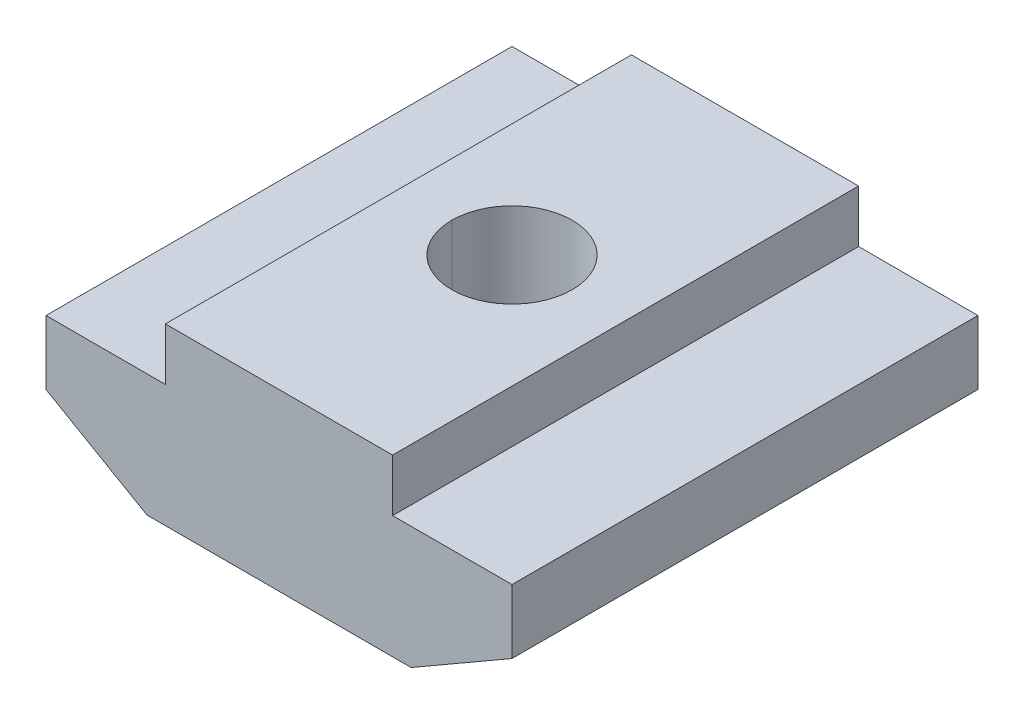
ISO-10303-21;
HEADER;
FILE_DESCRIPTION(('STEP AP214'),'2;1');
FILE_NAME('part.step','',(''),(''),'','','');
FILE_SCHEMA(('AUTOMOTIVE_DESIGN { 1 0 10303 214 1 1 1 1 }'));
ENDSEC;
DATA;
#1=APPLICATION_CONTEXT('core data for automotive mechanical design processes');
#2=APPLICATION_PROTOCOL_DEFINITION('international standard','automotive_design',2000,#1);
#3=PRODUCT_CONTEXT('',#1,'mechanical');
#4=PRODUCT('Part','Part','',(#3));
#5=PRODUCT_RELATED_PRODUCT_CATEGORY('part','',(#4));
#6=PRODUCT_DEFINITION_FORMATION('','',#4);
#7=PRODUCT_DEFINITION_CONTEXT('part definition',#1,'design');
#8=PRODUCT_DEFINITION('design','',#6,#7);
#9=PRODUCT_DEFINITION_SHAPE('','',#8);
#10=(LENGTH_UNIT() NAMED_UNIT(*) SI_UNIT(.MILLI.,.METRE.));
#11=(NAMED_UNIT(*) PLANE_ANGLE_UNIT() SI_UNIT($,.RADIAN.));
#12=(NAMED_UNIT(*) SI_UNIT($,.STERADIAN.) SOLID_ANGLE_UNIT());
#13=UNCERTAINTY_MEASURE_WITH_UNIT(LENGTH_MEASURE(1.E-05),#10,'distance_accuracy_value','');
#14=(GEOMETRIC_REPRESENTATION_CONTEXT(3) GLOBAL_UNCERTAINTY_ASSIGNED_CONTEXT((#13)) GLOBAL_UNIT_ASSIGNED_CONTEXT((#10,
#11,#12)) REPRESENTATION_CONTEXT('',''));
#15=CARTESIAN_POINT('',(0.,0.,0.));
#16=DIRECTION('',(0.,0.,1.));
#17=DIRECTION('',(1.,0.,0.));
#18=AXIS2_PLACEMENT_3D('',#15,#16,#17);
#19=CARTESIAN_POINT('',(-8.,-0.1,0.));
#20=DIRECTION('',(0.50000000000019,0.866025403784329,0.));
#21=DIRECTION('',(0.,0.,-1.));
#22=AXIS2_PLACEMENT_3D('',#19,#20,#21);
#23=PLANE('',#22);
#24=DIRECTION('',(0.,0.,1.));
#25=VECTOR('',#24,1.);
#26=CARTESIAN_POINT('',(-8.,-0.1,0.));
#27=LINE('',#26,#25);
#28=CARTESIAN_POINT('',(-8.,-0.1,-8.));
#29=VERTEX_POINT('',#28);
#30=CARTESIAN_POINT('',(-8.,-0.1,8.));
#31=VERTEX_POINT('',#30);
#32=EDGE_CURVE('E245',#29,#31,#27,.T.);
#33=ORIENTED_EDGE('',*,*,#32,.F.);
#34=DIRECTION('',(0.866025403784329,-0.50000000000019,0.));
#35=VECTOR('',#34,1.);
#36=CARTESIAN_POINT('',(-6.26794919243,-1.1,-8.));
#37=LINE('',#36,#35);
#38=CARTESIAN_POINT('',(-4.53589838486,-2.1,-8.));
#39=VERTEX_POINT('',#38);
#40=EDGE_CURVE('E258',#29,#39,#37,.T.);
#41=ORIENTED_EDGE('',*,*,#40,.T.);
#42=DIRECTION('',(0.,0.,1.));
#43=VECTOR('',#42,1.);
#44=CARTESIAN_POINT('',(-4.53589838486,-2.1,0.));
#45=LINE('',#44,#43);
#46=CARTESIAN_POINT('',(-4.53589838486,-2.1,8.));
#47=VERTEX_POINT('',#46);
#48=EDGE_CURVE('E11',#39,#47,#45,.T.);
#49=ORIENTED_EDGE('',*,*,#48,.T.);
#50=DIRECTION('',(-0.866025403784329,0.50000000000019,0.));
#51=VECTOR('',#50,1.);
#52=CARTESIAN_POINT('',(-6.26794919243,-1.1,8.));
#53=LINE('',#52,#51);
#54=EDGE_CURVE('E26',#47,#31,#53,.T.);
#55=ORIENTED_EDGE('',*,*,#54,.T.);
#56=EDGE_LOOP('',(#33,#41,#49,#55));
#57=FACE_BOUND('',#56,.T.);
#58=ADVANCED_FACE('F17',(#57),#23,.F.);
#59=CARTESIAN_POINT('',(8.,-2.1,0.));
#60=DIRECTION('',(0.,1.,0.));
#61=DIRECTION('',(1.,0.,0.));
#62=AXIS2_PLACEMENT_3D('',#59,#60,#61);
#63=PLANE('',#62);
#64=CARTESIAN_POINT('',(0.,-2.1,0.));
#65=DIRECTION('',(0.,1.,0.));
#66=DIRECTION('',(1.,0.,0.));
#67=AXIS2_PLACEMENT_3D('',#64,#65,#66);
#68=CIRCLE('',#67,2.067);
#69=CARTESIAN_POINT('',(-2.067,-2.1,0.));
#70=VERTEX_POINT('',#69);
#71=CARTESIAN_POINT('',(2.067,-2.1,0.));
#72=VERTEX_POINT('',#71);
#73=EDGE_CURVE('E145',#70,#72,#68,.T.);
#74=ORIENTED_EDGE('',*,*,#73,.T.);
#75=CARTESIAN_POINT('',(0.,-2.1,0.));
#76=DIRECTION('',(0.,1.,0.));
#77=DIRECTION('',(1.,0.,0.));
#78=AXIS2_PLACEMENT_3D('',#75,#76,#77);
#79=CIRCLE('',#78,2.067);
#80=EDGE_CURVE('E144',#72,#70,#79,.T.);
#81=ORIENTED_EDGE('',*,*,#80,.T.);
#82=EDGE_LOOP('',(#74,#81));
#83=FACE_BOUND('',#82,.T.);
#84=ORIENTED_EDGE('',*,*,#48,.F.);
#85=DIRECTION('',(1.,0.,0.));
#86=VECTOR('',#85,1.);
#87=CARTESIAN_POINT('',(0.,-2.1,-8.));
#88=LINE('',#87,#86);
#89=CARTESIAN_POINT('',(4.53589838486,-2.1,-8.));
#90=VERTEX_POINT('',#89);
#91=EDGE_CURVE('E261',#39,#90,#88,.T.);
#92=ORIENTED_EDGE('',*,*,#91,.T.);
#93=DIRECTION('',(0.,0.,1.));
#94=VECTOR('',#93,1.);
#95=CARTESIAN_POINT('',(4.53589838486,-2.1,0.));
#96=LINE('',#95,#94);
#97=CARTESIAN_POINT('',(4.53589838486,-2.1,8.));
#98=VERTEX_POINT('',#97);
#99=EDGE_CURVE('E235',#90,#98,#96,.T.);
#100=ORIENTED_EDGE('',*,*,#99,.T.);
#101=DIRECTION('',(1.,0.,0.));
#102=VECTOR('',#101,1.);
#103=CARTESIAN_POINT('',(0.,-2.1,8.));
#104=LINE('',#103,#102);
#105=EDGE_CURVE('E264',#47,#98,#104,.T.);
#106=ORIENTED_EDGE('',*,*,#105,.F.);
#107=EDGE_LOOP('',(#84,#92,#100,#106));
#108=FACE_BOUND('',#107,.T.);
#109=ADVANCED_FACE('F19',(#83,#108),#63,.F.);
#110=CARTESIAN_POINT('',(0.,0.,8.));
#111=DIRECTION('',(0.,0.,1.));
#112=DIRECTION('',(1.,0.,0.));
#113=AXIS2_PLACEMENT_3D('',#110,#111,#112);
#114=PLANE('',#113);
#115=ORIENTED_EDGE('',*,*,#105,.T.);
#116=DIRECTION('',(-0.866025403784329,-0.50000000000019,0.));
#117=VECTOR('',#116,1.);
#118=CARTESIAN_POINT('',(6.26794919243,-1.1,8.));
#119=LINE('',#118,#117);
#120=CARTESIAN_POINT('',(8.,-0.1,8.));
#121=VERTEX_POINT('',#120);
#122=EDGE_CURVE('E248',#121,#98,#119,.T.);
#123=ORIENTED_EDGE('',*,*,#122,.F.);
#124=DIRECTION('',(0.,1.,0.));
#125=VECTOR('',#124,1.);
#126=CARTESIAN_POINT('',(8.,1.,8.));
#127=LINE('',#126,#125);
#128=CARTESIAN_POINT('',(8.,2.1,8.));
#129=VERTEX_POINT('',#128);
#130=EDGE_CURVE('E232',#121,#129,#127,.T.);
#131=ORIENTED_EDGE('',*,*,#130,.T.);
#132=DIRECTION('',(-1.,0.,0.));
#133=VECTOR('',#132,1.);
#134=CARTESIAN_POINT('',(5.95,2.1,8.));
#135=LINE('',#134,#133);
#136=CARTESIAN_POINT('',(3.9,2.1,8.));
#137=VERTEX_POINT('',#136);
#138=EDGE_CURVE('E188',#129,#137,#135,.T.);
#139=ORIENTED_EDGE('',*,*,#138,.T.);
#140=DIRECTION('',(0.,1.,0.));
#141=VECTOR('',#140,1.);
#142=CARTESIAN_POINT('',(3.9,3.,8.));
#143=LINE('',#142,#141);
#144=CARTESIAN_POINT('',(3.9,3.9,8.));
#145=VERTEX_POINT('',#144);
#146=EDGE_CURVE('E193',#137,#145,#143,.T.);
#147=ORIENTED_EDGE('',*,*,#146,.T.);
#148=DIRECTION('',(-1.,0.,0.));
#149=VECTOR('',#148,1.);
#150=CARTESIAN_POINT('',(0.,3.9,8.));
#151=LINE('',#150,#149);
#152=CARTESIAN_POINT('',(-3.9,3.9,8.));
#153=VERTEX_POINT('',#152);
#154=EDGE_CURVE('E192',#145,#153,#151,.T.);
#155=ORIENTED_EDGE('',*,*,#154,.T.);
#156=DIRECTION('',(0.,-1.,0.));
#157=VECTOR('',#156,1.);
#158=CARTESIAN_POINT('',(-3.9,3.,8.));
#159=LINE('',#158,#157);
#160=CARTESIAN_POINT('',(-3.9,2.1,8.));
#161=VERTEX_POINT('',#160);
#162=EDGE_CURVE('E165',#153,#161,#159,.T.);
#163=ORIENTED_EDGE('',*,*,#162,.T.);
#164=DIRECTION('',(-1.,0.,0.));
#165=VECTOR('',#164,1.);
#166=CARTESIAN_POINT('',(-5.95,2.1,8.));
#167=LINE('',#166,#165);
#168=CARTESIAN_POINT('',(-8.,2.1,8.));
#169=VERTEX_POINT('',#168);
#170=EDGE_CURVE('E172',#161,#169,#167,.T.);
#171=ORIENTED_EDGE('',*,*,#170,.T.);
#172=DIRECTION('',(0.,-1.,0.));
#173=VECTOR('',#172,1.);
#174=CARTESIAN_POINT('',(-8.,1.,8.));
#175=LINE('',#174,#173);
#176=EDGE_CURVE('E240',#169,#31,#175,.T.);
#177=ORIENTED_EDGE('',*,*,#176,.T.);
#178=ORIENTED_EDGE('',*,*,#54,.F.);
#179=EDGE_LOOP('',(#115,#123,#131,#139,#147,#155,#163,#171,#177,#178));
#180=FACE_BOUND('',#179,.T.);
#181=ADVANCED_FACE('F270',(#180),#114,.T.);
#182=CARTESIAN_POINT('',(0.,0.,-8.));
#183=DIRECTION('',(0.,0.,1.));
#184=DIRECTION('',(1.,0.,0.));
#185=AXIS2_PLACEMENT_3D('',#182,#183,#184);
#186=PLANE('',#185);
#187=ORIENTED_EDGE('',*,*,#40,.F.);
#188=DIRECTION('',(0.,-1.,0.));
#189=VECTOR('',#188,1.);
#190=CARTESIAN_POINT('',(-8.,1.,-8.));
#191=LINE('',#190,#189);
#192=CARTESIAN_POINT('',(-8.,2.1,-8.));
#193=VERTEX_POINT('',#192);
#194=EDGE_CURVE('E244',#193,#29,#191,.T.);
#195=ORIENTED_EDGE('',*,*,#194,.F.);
#196=DIRECTION('',(-1.,0.,0.));
#197=VECTOR('',#196,1.);
#198=CARTESIAN_POINT('',(-5.95,2.1,-8.));
#199=LINE('',#198,#197);
#200=CARTESIAN_POINT('',(-3.9,2.1,-8.));
#201=VERTEX_POINT('',#200);
#202=EDGE_CURVE('E173',#201,#193,#199,.T.);
#203=ORIENTED_EDGE('',*,*,#202,.F.);
#204=DIRECTION('',(0.,-1.,0.));
#205=VECTOR('',#204,1.);
#206=CARTESIAN_POINT('',(-3.9,3.,-8.));
#207=LINE('',#206,#205);
#208=CARTESIAN_POINT('',(-3.9,3.9,-8.));
#209=VERTEX_POINT('',#208);
#210=EDGE_CURVE('E163',#209,#201,#207,.T.);
#211=ORIENTED_EDGE('',*,*,#210,.F.);
#212=DIRECTION('',(-1.,0.,0.));
#213=VECTOR('',#212,1.);
#214=CARTESIAN_POINT('',(0.,3.9,-8.));
#215=LINE('',#214,#213);
#216=CARTESIAN_POINT('',(3.9,3.9,-8.));
#217=VERTEX_POINT('',#216);
#218=EDGE_CURVE('E189',#217,#209,#215,.T.);
#219=ORIENTED_EDGE('',*,*,#218,.F.);
#220=DIRECTION('',(0.,1.,0.));
#221=VECTOR('',#220,1.);
#222=CARTESIAN_POINT('',(3.9,3.,-8.));
#223=LINE('',#222,#221);
#224=CARTESIAN_POINT('',(3.9,2.1,-8.));
#225=VERTEX_POINT('',#224);
#226=EDGE_CURVE('E212',#225,#217,#223,.T.);
#227=ORIENTED_EDGE('',*,*,#226,.F.);
#228=DIRECTION('',(-1.,0.,0.));
#229=VECTOR('',#228,1.);
#230=CARTESIAN_POINT('',(5.95,2.1,-8.));
#231=LINE('',#230,#229);
#232=CARTESIAN_POINT('',(8.,2.1,-8.));
#233=VERTEX_POINT('',#232);
#234=EDGE_CURVE('E162',#233,#225,#231,.T.);
#235=ORIENTED_EDGE('',*,*,#234,.F.);
#236=DIRECTION('',(0.,1.,0.));
#237=VECTOR('',#236,1.);
#238=CARTESIAN_POINT('',(8.,1.,-8.));
#239=LINE('',#238,#237);
#240=CARTESIAN_POINT('',(8.,-0.1,-8.));
#241=VERTEX_POINT('',#240);
#242=EDGE_CURVE('E229',#241,#233,#239,.T.);
#243=ORIENTED_EDGE('',*,*,#242,.F.);
#244=DIRECTION('',(0.866025403784329,0.50000000000019,0.));
#245=VECTOR('',#244,1.);
#246=CARTESIAN_POINT('',(6.26794919243,-1.1,-8.));
#247=LINE('',#246,#245);
#248=EDGE_CURVE('E239',#90,#241,#247,.T.);
#249=ORIENTED_EDGE('',*,*,#248,.F.);
#250=ORIENTED_EDGE('',*,*,#91,.F.);
#251=EDGE_LOOP('',(#187,#195,#203,#211,#219,#227,#235,#243,#249,#250));
#252=FACE_BOUND('',#251,.T.);
#253=ADVANCED_FACE('F277',(#252),#186,.F.);
#254=CARTESIAN_POINT('',(-8.,-2.1,0.));
#255=DIRECTION('',(1.,0.,0.));
#256=DIRECTION('',(0.,1.,0.));
#257=AXIS2_PLACEMENT_3D('',#254,#255,#256);
#258=PLANE('',#257);
#259=ORIENTED_EDGE('',*,*,#32,.T.);
#260=ORIENTED_EDGE('',*,*,#176,.F.);
#261=DIRECTION('',(0.,0.,1.));
#262=VECTOR('',#261,1.);
#263=CARTESIAN_POINT('',(-8.,2.1,0.));
#264=LINE('',#263,#262);
#265=EDGE_CURVE('E168',#193,#169,#264,.T.);
#266=ORIENTED_EDGE('',*,*,#265,.F.);
#267=ORIENTED_EDGE('',*,*,#194,.T.);
#268=EDGE_LOOP('',(#259,#260,#266,#267));
#269=FACE_BOUND('',#268,.T.);
#270=ADVANCED_FACE('F274',(#269),#258,.F.);
#271=CARTESIAN_POINT('',(8.,-0.1,0.));
#272=DIRECTION('',(-0.50000000000019,0.866025403784329,0.));
#273=DIRECTION('',(0.,0.,1.));
#274=AXIS2_PLACEMENT_3D('',#271,#272,#273);
#275=PLANE('',#274);
#276=ORIENTED_EDGE('',*,*,#99,.F.);
#277=ORIENTED_EDGE('',*,*,#248,.T.);
#278=DIRECTION('',(0.,0.,1.));
#279=VECTOR('',#278,1.);
#280=CARTESIAN_POINT('',(8.,-0.1,0.));
#281=LINE('',#280,#279);
#282=EDGE_CURVE('E225',#241,#121,#281,.T.);
#283=ORIENTED_EDGE('',*,*,#282,.T.);
#284=ORIENTED_EDGE('',*,*,#122,.T.);
#285=EDGE_LOOP('',(#276,#277,#283,#284));
#286=FACE_BOUND('',#285,.T.);
#287=ADVANCED_FACE('F284',(#286),#275,.F.);
#288=CARTESIAN_POINT('',(8.,2.1,0.));
#289=DIRECTION('',(-1.,0.,0.));
#290=DIRECTION('',(0.,0.,1.));
#291=AXIS2_PLACEMENT_3D('',#288,#289,#290);
#292=PLANE('',#291);
#293=ORIENTED_EDGE('',*,*,#282,.F.);
#294=ORIENTED_EDGE('',*,*,#242,.T.);
#295=DIRECTION('',(0.,0.,1.));
#296=VECTOR('',#295,1.);
#297=CARTESIAN_POINT('',(8.,2.1,0.));
#298=LINE('',#297,#296);
#299=EDGE_CURVE('E178',#233,#129,#298,.T.);
#300=ORIENTED_EDGE('',*,*,#299,.T.);
#301=ORIENTED_EDGE('',*,*,#130,.F.);
#302=EDGE_LOOP('',(#293,#294,#300,#301));
#303=FACE_BOUND('',#302,.T.);
#304=ADVANCED_FACE('F289',(#303),#292,.F.);
#305=CARTESIAN_POINT('',(-3.9,3.9,0.));
#306=DIRECTION('',(0.,-1.,0.));
#307=DIRECTION('',(0.,0.,-1.));
#308=AXIS2_PLACEMENT_3D('',#305,#306,#307);
#309=PLANE('',#308);
#310=CARTESIAN_POINT('',(0.,3.9,0.));
#311=DIRECTION('',(0.,-1.,0.));
#312=DIRECTION('',(1.,0.,0.));
#313=AXIS2_PLACEMENT_3D('',#310,#311,#312);
#314=CIRCLE('',#313,2.067);
#315=CARTESIAN_POINT('',(2.067,3.9,0.));
#316=VERTEX_POINT('',#315);
#317=CARTESIAN_POINT('',(-2.067,3.9,0.));
#318=VERTEX_POINT('',#317);
#319=EDGE_CURVE('E147',#316,#318,#314,.T.);
#320=ORIENTED_EDGE('',*,*,#319,.T.);
#321=CARTESIAN_POINT('',(0.,3.9,0.));
#322=DIRECTION('',(0.,-1.,0.));
#323=DIRECTION('',(1.,0.,0.));
#324=AXIS2_PLACEMENT_3D('',#321,#322,#323);
#325=CIRCLE('',#324,2.067);
#326=EDGE_CURVE('E134',#318,#316,#325,.T.);
#327=ORIENTED_EDGE('',*,*,#326,.T.);
#328=EDGE_LOOP('',(#320,#327));
#329=FACE_BOUND('',#328,.T.);
#330=DIRECTION('',(0.,0.,1.));
#331=VECTOR('',#330,1.);
#332=CARTESIAN_POINT('',(3.9,3.9,0.));
#333=LINE('',#332,#331);
#334=EDGE_CURVE('E216',#217,#145,#333,.T.);
#335=ORIENTED_EDGE('',*,*,#334,.F.);
#336=ORIENTED_EDGE('',*,*,#218,.T.);
#337=DIRECTION('',(0.,0.,1.));
#338=VECTOR('',#337,1.);
#339=CARTESIAN_POINT('',(-3.9,3.9,0.));
#340=LINE('',#339,#338);
#341=EDGE_CURVE('E166',#209,#153,#340,.T.);
#342=ORIENTED_EDGE('',*,*,#341,.T.);
#343=ORIENTED_EDGE('',*,*,#154,.F.);
#344=EDGE_LOOP('',(#335,#336,#342,#343));
#345=FACE_BOUND('',#344,.T.);
#346=ADVANCED_FACE('F148',(#329,#345),#309,.F.);
#347=CARTESIAN_POINT('',(3.9,3.9,0.));
#348=DIRECTION('',(-1.,0.,0.));
#349=DIRECTION('',(0.,0.,1.));
#350=AXIS2_PLACEMENT_3D('',#347,#348,#349);
#351=PLANE('',#350);
#352=DIRECTION('',(0.,0.,1.));
#353=VECTOR('',#352,1.);
#354=CARTESIAN_POINT('',(3.9,2.1,0.));
#355=LINE('',#354,#353);
#356=EDGE_CURVE('E184',#225,#137,#355,.T.);
#357=ORIENTED_EDGE('',*,*,#356,.F.);
#358=ORIENTED_EDGE('',*,*,#226,.T.);
#359=ORIENTED_EDGE('',*,*,#334,.T.);
#360=ORIENTED_EDGE('',*,*,#146,.F.);
#361=EDGE_LOOP('',(#357,#358,#359,#360));
#362=FACE_BOUND('',#361,.T.);
#363=ADVANCED_FACE('F299',(#362),#351,.F.);
#364=CARTESIAN_POINT('',(-3.9,2.1,0.));
#365=DIRECTION('',(1.,0.,0.));
#366=DIRECTION('',(0.,1.,0.));
#367=AXIS2_PLACEMENT_3D('',#364,#365,#366);
#368=PLANE('',#367);
#369=ORIENTED_EDGE('',*,*,#341,.F.);
#370=ORIENTED_EDGE('',*,*,#210,.T.);
#371=DIRECTION('',(0.,0.,1.));
#372=VECTOR('',#371,1.);
#373=CARTESIAN_POINT('',(-3.9,2.1,0.));
#374=LINE('',#373,#372);
#375=EDGE_CURVE('E197',#201,#161,#374,.T.);
#376=ORIENTED_EDGE('',*,*,#375,.T.);
#377=ORIENTED_EDGE('',*,*,#162,.F.);
#378=EDGE_LOOP('',(#369,#370,#376,#377));
#379=FACE_BOUND('',#378,.T.);
#380=ADVANCED_FACE('F302',(#379),#368,.F.);
#381=CARTESIAN_POINT('',(3.9,2.1,0.));
#382=DIRECTION('',(0.,-1.,0.));
#383=DIRECTION('',(0.,0.,-1.));
#384=AXIS2_PLACEMENT_3D('',#381,#382,#383);
#385=PLANE('',#384);
#386=ORIENTED_EDGE('',*,*,#375,.F.);
#387=ORIENTED_EDGE('',*,*,#202,.T.);
#388=ORIENTED_EDGE('',*,*,#265,.T.);
#389=ORIENTED_EDGE('',*,*,#170,.F.);
#390=EDGE_LOOP('',(#386,#387,#388,#389));
#391=FACE_BOUND('',#390,.T.);
#392=ADVANCED_FACE('F304',(#391),#385,.F.);
#393=CARTESIAN_POINT('',(3.9,2.1,0.));
#394=DIRECTION('',(0.,-1.,0.));
#395=DIRECTION('',(0.,0.,-1.));
#396=AXIS2_PLACEMENT_3D('',#393,#394,#395);
#397=PLANE('',#396);
#398=ORIENTED_EDGE('',*,*,#299,.F.);
#399=ORIENTED_EDGE('',*,*,#234,.T.);
#400=ORIENTED_EDGE('',*,*,#356,.T.);
#401=ORIENTED_EDGE('',*,*,#138,.F.);
#402=EDGE_LOOP('',(#398,#399,#400,#401));
#403=FACE_BOUND('',#402,.T.);
#404=ADVANCED_FACE('F294',(#403),#397,.F.);
#405=CARTESIAN_POINT('',(0.,-2.1,0.));
#406=DIRECTION('',(0.,1.,0.));
#407=DIRECTION('',(1.,0.,0.));
#408=AXIS2_PLACEMENT_3D('',#405,#406,#407);
#409=CYLINDRICAL_SURFACE('',#408,2.067);
#410=DIRECTION('',(0.,-1.,0.));
#411=VECTOR('',#410,1.);
#412=CARTESIAN_POINT('',(2.067,2.74499999998,0.));
#413=LINE('',#412,#411);
#414=EDGE_CURVE('E140',#316,#72,#413,.T.);
#415=ORIENTED_EDGE('',*,*,#414,.F.);
#416=ORIENTED_EDGE('',*,*,#326,.F.);
#417=DIRECTION('',(0.,-1.,0.));
#418=VECTOR('',#417,1.);
#419=CARTESIAN_POINT('',(-2.067,2.74499999998,0.));
#420=LINE('',#419,#418);
#421=EDGE_CURVE('E138',#318,#70,#420,.T.);
#422=ORIENTED_EDGE('',*,*,#421,.T.);
#423=ORIENTED_EDGE('',*,*,#80,.F.);
#424=EDGE_LOOP('',(#415,#416,#422,#423));
#425=FACE_BOUND('',#424,.T.);
#426=ADVANCED_FACE('F136',(#425),#409,.F.);
#427=CARTESIAN_POINT('',(0.,-2.1,0.));
#428=DIRECTION('',(0.,1.,0.));
#429=DIRECTION('',(1.,0.,0.));
#430=AXIS2_PLACEMENT_3D('',#427,#428,#429);
#431=CYLINDRICAL_SURFACE('',#430,2.067);
#432=ORIENTED_EDGE('',*,*,#421,.F.);
#433=ORIENTED_EDGE('',*,*,#319,.F.);
#434=ORIENTED_EDGE('',*,*,#414,.T.);
#435=ORIENTED_EDGE('',*,*,#73,.F.);
#436=EDGE_LOOP('',(#432,#433,#434,#435));
#437=FACE_BOUND('',#436,.T.);
#438=ADVANCED_FACE('F154',(#437),#431,.F.);
#439=CLOSED_SHELL('',(#58,#109,#181,#253,#270,#287,#304,#346,#363,#380,#392,#404,#426,#438));
#440=MANIFOLD_SOLID_BREP('B1',#439);
#441=ADVANCED_BREP_SHAPE_REPRESENTATION('',(#18,#440),#14);
#442=SHAPE_DEFINITION_REPRESENTATION(#9,#441);
ENDSEC;
END-ISO-10303-21;
